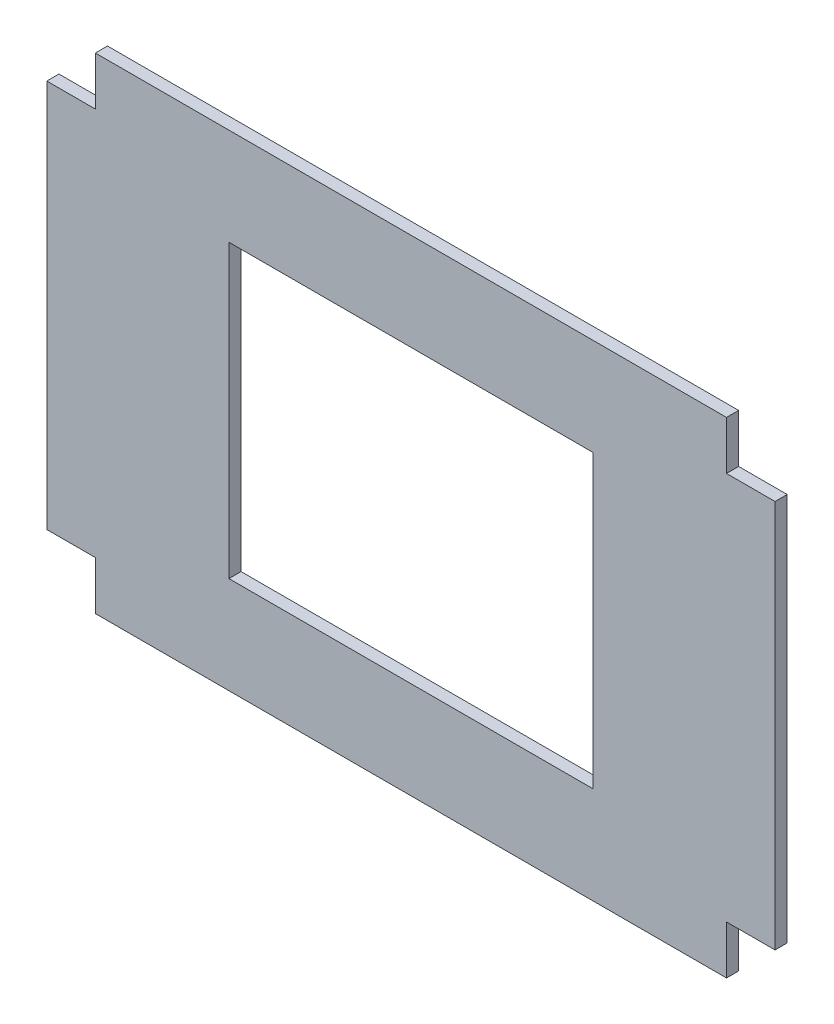
ISO-10303-21;
HEADER;
FILE_DESCRIPTION(('STEP AP214'),'2;1');
FILE_NAME('part.step','',(''),(''),'','','');
FILE_SCHEMA(('AUTOMOTIVE_DESIGN { 1 0 10303 214 1 1 1 1 }'));
ENDSEC;
DATA;
#1=APPLICATION_CONTEXT('core data for automotive mechanical design processes');
#2=APPLICATION_PROTOCOL_DEFINITION('international standard','automotive_design',2000,#1);
#3=PRODUCT_CONTEXT('',#1,'mechanical');
#4=PRODUCT('Part','Part','',(#3));
#5=PRODUCT_RELATED_PRODUCT_CATEGORY('part','',(#4));
#6=PRODUCT_DEFINITION_FORMATION('','',#4);
#7=PRODUCT_DEFINITION_CONTEXT('part definition',#1,'design');
#8=PRODUCT_DEFINITION('design','',#6,#7);
#9=PRODUCT_DEFINITION_SHAPE('','',#8);
#10=(LENGTH_UNIT() NAMED_UNIT(*) SI_UNIT(.MILLI.,.METRE.));
#11=(NAMED_UNIT(*) PLANE_ANGLE_UNIT() SI_UNIT($,.RADIAN.));
#12=(NAMED_UNIT(*) SI_UNIT($,.STERADIAN.) SOLID_ANGLE_UNIT());
#13=UNCERTAINTY_MEASURE_WITH_UNIT(LENGTH_MEASURE(1.E-05),#10,'distance_accuracy_value','');
#14=(GEOMETRIC_REPRESENTATION_CONTEXT(3) GLOBAL_UNCERTAINTY_ASSIGNED_CONTEXT((#13)) GLOBAL_UNIT_ASSIGNED_CONTEXT((#10,
#11,#12)) REPRESENTATION_CONTEXT('',''));
#15=CARTESIAN_POINT('',(0.,0.,0.));
#16=DIRECTION('',(0.,0.,1.));
#17=DIRECTION('',(1.,0.,0.));
#18=AXIS2_PLACEMENT_3D('',#15,#16,#17);
#19=CARTESIAN_POINT('',(5.06544502617801,8.7369109947644,5.));
#20=DIRECTION('',(-1.,0.,0.));
#21=DIRECTION('',(0.,-1.,0.));
#22=AXIS2_PLACEMENT_3D('',#19,#20,#21);
#23=PLANE('',#22);
#24=DIRECTION('',(0.,1.,0.));
#25=VECTOR('',#24,1.);
#26=CARTESIAN_POINT('',(5.06544502617801,8.7369109947644,0.));
#27=LINE('',#26,#25);
#28=CARTESIAN_POINT('',(5.06544502617801,-171.263089005236,0.));
#29=VERTEX_POINT('',#28);
#30=CARTESIAN_POINT('',(5.06544502617801,-11.2630890052356,0.));
#31=VERTEX_POINT('',#30);
#32=EDGE_CURVE('E256',#29,#31,#27,.T.);
#33=ORIENTED_EDGE('',*,*,#32,.T.);
#34=DIRECTION('',(0.,0.,1.));
#35=VECTOR('',#34,1.);
#36=CARTESIAN_POINT('',(5.06544502617801,-11.2630890052356,-5.));
#37=LINE('',#36,#35);
#38=CARTESIAN_POINT('',(5.06544502617801,-11.2630890052356,5.));
#39=VERTEX_POINT('',#38);
#40=EDGE_CURVE('E218',#31,#39,#37,.T.);
#41=ORIENTED_EDGE('',*,*,#40,.T.);
#42=DIRECTION('',(0.,1.,0.));
#43=VECTOR('',#42,1.);
#44=CARTESIAN_POINT('',(5.06544502617801,8.7369109947644,5.));
#45=LINE('',#44,#43);
#46=CARTESIAN_POINT('',(5.06544502617801,-171.263089005236,5.));
#47=VERTEX_POINT('',#46);
#48=EDGE_CURVE('E262',#47,#39,#45,.T.);
#49=ORIENTED_EDGE('',*,*,#48,.F.);
#50=DIRECTION('',(0.,0.,1.));
#51=VECTOR('',#50,1.);
#52=CARTESIAN_POINT('',(5.06544502617801,-171.263089005236,-5.));
#53=LINE('',#52,#51);
#54=EDGE_CURVE('E194',#29,#47,#53,.T.);
#55=ORIENTED_EDGE('',*,*,#54,.F.);
#56=EDGE_LOOP('',(#33,#41,#49,#55));
#57=FACE_BOUND('',#56,.T.);
#58=ADVANCED_FACE('F45',(#57),#23,.F.);
#59=CARTESIAN_POINT('',(-294.934554973822,8.7369109947644,5.));
#60=DIRECTION('',(0.,-1.,0.));
#61=DIRECTION('',(0.,0.,-1.));
#62=AXIS2_PLACEMENT_3D('',#59,#60,#61);
#63=PLANE('',#62);
#64=DIRECTION('',(-1.,0.,0.));
#65=VECTOR('',#64,1.);
#66=CARTESIAN_POINT('',(-294.934554973822,8.7369109947644,5.));
#67=LINE('',#66,#65);
#68=CARTESIAN_POINT('',(-14.934554973822,8.7369109947644,5.));
#69=VERTEX_POINT('',#68);
#70=CARTESIAN_POINT('',(-274.934554973822,8.7369109947644,5.));
#71=VERTEX_POINT('',#70);
#72=EDGE_CURVE('E266',#69,#71,#67,.T.);
#73=ORIENTED_EDGE('',*,*,#72,.F.);
#74=DIRECTION('',(0.,0.,1.));
#75=VECTOR('',#74,1.);
#76=CARTESIAN_POINT('',(-14.934554973822,8.7369109947644,-5.));
#77=LINE('',#76,#75);
#78=CARTESIAN_POINT('',(-14.934554973822,8.7369109947644,0.));
#79=VERTEX_POINT('',#78);
#80=EDGE_CURVE('E211',#79,#69,#77,.T.);
#81=ORIENTED_EDGE('',*,*,#80,.F.);
#82=DIRECTION('',(-1.,0.,0.));
#83=VECTOR('',#82,1.);
#84=CARTESIAN_POINT('',(-294.934554973822,8.7369109947644,0.));
#85=LINE('',#84,#83);
#86=CARTESIAN_POINT('',(-274.934554973822,8.7369109947644,0.));
#87=VERTEX_POINT('',#86);
#88=EDGE_CURVE('E283',#79,#87,#85,.T.);
#89=ORIENTED_EDGE('',*,*,#88,.T.);
#90=DIRECTION('',(0.,0.,1.));
#91=VECTOR('',#90,1.);
#92=CARTESIAN_POINT('',(-274.934554973822,8.7369109947644,-5.));
#93=LINE('',#92,#91);
#94=EDGE_CURVE('E252',#87,#71,#93,.T.);
#95=ORIENTED_EDGE('',*,*,#94,.T.);
#96=EDGE_LOOP('',(#73,#81,#89,#95));
#97=FACE_BOUND('',#96,.T.);
#98=ADVANCED_FACE('F353',(#97),#63,.F.);
#99=CARTESIAN_POINT('',(-294.934554973822,8.7369109947644,5.));
#100=DIRECTION('',(1.,0.,0.));
#101=DIRECTION('',(0.,0.,-1.));
#102=AXIS2_PLACEMENT_3D('',#99,#100,#101);
#103=PLANE('',#102);
#104=DIRECTION('',(0.,-1.,0.));
#105=VECTOR('',#104,1.);
#106=CARTESIAN_POINT('',(-294.934554973822,8.7369109947644,0.));
#107=LINE('',#106,#105);
#108=CARTESIAN_POINT('',(-294.934554973822,-11.2630890052356,0.));
#109=VERTEX_POINT('',#108);
#110=CARTESIAN_POINT('',(-294.934554973822,-171.263089005236,0.));
#111=VERTEX_POINT('',#110);
#112=EDGE_CURVE('E287',#109,#111,#107,.T.);
#113=ORIENTED_EDGE('',*,*,#112,.T.);
#114=DIRECTION('',(0.,0.,1.));
#115=VECTOR('',#114,1.);
#116=CARTESIAN_POINT('',(-294.934554973822,-171.263089005236,-5.));
#117=LINE('',#116,#115);
#118=CARTESIAN_POINT('',(-294.934554973822,-171.263089005236,5.));
#119=VERTEX_POINT('',#118);
#120=EDGE_CURVE('E210',#111,#119,#117,.T.);
#121=ORIENTED_EDGE('',*,*,#120,.T.);
#122=DIRECTION('',(0.,-1.,0.));
#123=VECTOR('',#122,1.);
#124=CARTESIAN_POINT('',(-294.934554973822,8.7369109947644,5.));
#125=LINE('',#124,#123);
#126=CARTESIAN_POINT('',(-294.934554973822,-11.2630890052356,5.));
#127=VERTEX_POINT('',#126);
#128=EDGE_CURVE('E271',#127,#119,#125,.T.);
#129=ORIENTED_EDGE('',*,*,#128,.F.);
#130=DIRECTION('',(0.,0.,1.));
#131=VECTOR('',#130,1.);
#132=CARTESIAN_POINT('',(-294.934554973822,-11.2630890052356,-5.));
#133=LINE('',#132,#131);
#134=EDGE_CURVE('E251',#109,#127,#133,.T.);
#135=ORIENTED_EDGE('',*,*,#134,.F.);
#136=EDGE_LOOP('',(#113,#121,#129,#135));
#137=FACE_BOUND('',#136,.T.);
#138=ADVANCED_FACE('F358',(#137),#103,.F.);
#139=CARTESIAN_POINT('',(-294.934554973822,-191.263089005236,5.));
#140=DIRECTION('',(0.,1.,0.));
#141=DIRECTION('',(0.,0.,1.));
#142=AXIS2_PLACEMENT_3D('',#139,#140,#141);
#143=PLANE('',#142);
#144=DIRECTION('',(1.,0.,0.));
#145=VECTOR('',#144,1.);
#146=CARTESIAN_POINT('',(-294.934554973822,-191.263089005236,5.));
#147=LINE('',#146,#145);
#148=CARTESIAN_POINT('',(-274.934554973822,-191.263089005236,5.));
#149=VERTEX_POINT('',#148);
#150=CARTESIAN_POINT('',(-14.934554973822,-191.263089005236,5.));
#151=VERTEX_POINT('',#150);
#152=EDGE_CURVE('E275',#149,#151,#147,.T.);
#153=ORIENTED_EDGE('',*,*,#152,.F.);
#154=DIRECTION('',(0.,0.,1.));
#155=VECTOR('',#154,1.);
#156=CARTESIAN_POINT('',(-274.934554973822,-191.263089005236,-5.));
#157=LINE('',#156,#155);
#158=CARTESIAN_POINT('',(-274.934554973822,-191.263089005236,0.));
#159=VERTEX_POINT('',#158);
#160=EDGE_CURVE('E230',#159,#149,#157,.T.);
#161=ORIENTED_EDGE('',*,*,#160,.F.);
#162=DIRECTION('',(1.,0.,0.));
#163=VECTOR('',#162,1.);
#164=CARTESIAN_POINT('',(-294.934554973822,-191.263089005236,0.));
#165=LINE('',#164,#163);
#166=CARTESIAN_POINT('',(-14.934554973822,-191.263089005236,0.));
#167=VERTEX_POINT('',#166);
#168=EDGE_CURVE('E267',#159,#167,#165,.T.);
#169=ORIENTED_EDGE('',*,*,#168,.T.);
#170=DIRECTION('',(0.,0.,1.));
#171=VECTOR('',#170,1.);
#172=CARTESIAN_POINT('',(-14.934554973822,-191.263089005236,-5.));
#173=LINE('',#172,#171);
#174=EDGE_CURVE('E189',#167,#151,#173,.T.);
#175=ORIENTED_EDGE('',*,*,#174,.T.);
#176=EDGE_LOOP('',(#153,#161,#169,#175));
#177=FACE_BOUND('',#176,.T.);
#178=ADVANCED_FACE('F380',(#177),#143,.F.);
#179=CARTESIAN_POINT('',(0.,0.,5.));
#180=DIRECTION('',(0.,0.,1.));
#181=DIRECTION('',(1.,0.,0.));
#182=AXIS2_PLACEMENT_3D('',#179,#180,#181);
#183=PLANE('',#182);
#184=DIRECTION('',(0.,-1.,0.));
#185=VECTOR('',#184,1.);
#186=CARTESIAN_POINT('',(-219.934554973822,-151.263089005236,5.));
#187=LINE('',#186,#185);
#188=CARTESIAN_POINT('',(-219.934554973822,-31.2630890052356,5.));
#189=VERTEX_POINT('',#188);
#190=CARTESIAN_POINT('',(-219.934554973822,-151.263089005236,5.));
#191=VERTEX_POINT('',#190);
#192=EDGE_CURVE('E60',#189,#191,#187,.T.);
#193=ORIENTED_EDGE('',*,*,#192,.F.);
#194=DIRECTION('',(-1.,0.,0.));
#195=VECTOR('',#194,1.);
#196=CARTESIAN_POINT('',(-69.934554973822,-31.2630890052356,5.));
#197=LINE('',#196,#195);
#198=CARTESIAN_POINT('',(-69.934554973822,-31.2630890052356,5.));
#199=VERTEX_POINT('',#198);
#200=EDGE_CURVE('E179',#199,#189,#197,.T.);
#201=ORIENTED_EDGE('',*,*,#200,.F.);
#202=DIRECTION('',(0.,1.,0.));
#203=VECTOR('',#202,1.);
#204=CARTESIAN_POINT('',(-69.934554973822,-151.263089005236,5.));
#205=LINE('',#204,#203);
#206=CARTESIAN_POINT('',(-69.934554973822,-151.263089005236,5.));
#207=VERTEX_POINT('',#206);
#208=EDGE_CURVE('E161',#207,#199,#205,.T.);
#209=ORIENTED_EDGE('',*,*,#208,.F.);
#210=DIRECTION('',(1.,0.,0.));
#211=VECTOR('',#210,1.);
#212=CARTESIAN_POINT('',(-69.934554973822,-151.263089005236,5.));
#213=LINE('',#212,#211);
#214=EDGE_CURVE('E171',#191,#207,#213,.T.);
#215=ORIENTED_EDGE('',*,*,#214,.F.);
#216=EDGE_LOOP('',(#193,#201,#209,#215));
#217=FACE_BOUND('',#216,.T.);
#218=DIRECTION('',(1.,0.,0.));
#219=VECTOR('',#218,1.);
#220=CARTESIAN_POINT('',(5.06544502617801,-11.2630890052356,5.));
#221=LINE('',#220,#219);
#222=CARTESIAN_POINT('',(-14.934554973822,-11.2630890052356,5.));
#223=VERTEX_POINT('',#222);
#224=EDGE_CURVE('E214',#223,#39,#221,.T.);
#225=ORIENTED_EDGE('',*,*,#224,.F.);
#226=DIRECTION('',(0.,-1.,0.));
#227=VECTOR('',#226,1.);
#228=CARTESIAN_POINT('',(-14.934554973822,8.7369109947644,5.));
#229=LINE('',#228,#227);
#230=EDGE_CURVE('E225',#69,#223,#229,.T.);
#231=ORIENTED_EDGE('',*,*,#230,.F.);
#232=ORIENTED_EDGE('',*,*,#72,.T.);
#233=DIRECTION('',(0.,1.,0.));
#234=VECTOR('',#233,1.);
#235=CARTESIAN_POINT('',(-274.934554973822,8.7369109947644,5.));
#236=LINE('',#235,#234);
#237=CARTESIAN_POINT('',(-274.934554973822,-11.2630890052356,5.));
#238=VERTEX_POINT('',#237);
#239=EDGE_CURVE('E248',#238,#71,#236,.T.);
#240=ORIENTED_EDGE('',*,*,#239,.F.);
#241=DIRECTION('',(1.,0.,0.));
#242=VECTOR('',#241,1.);
#243=CARTESIAN_POINT('',(-294.934554973822,-11.2630890052356,5.));
#244=LINE('',#243,#242);
#245=EDGE_CURVE('E229',#127,#238,#244,.T.);
#246=ORIENTED_EDGE('',*,*,#245,.F.);
#247=ORIENTED_EDGE('',*,*,#128,.T.);
#248=DIRECTION('',(-1.,0.,0.));
#249=VECTOR('',#248,1.);
#250=CARTESIAN_POINT('',(-294.934554973822,-171.263089005236,5.));
#251=LINE('',#250,#249);
#252=CARTESIAN_POINT('',(-274.934554973822,-171.263089005236,5.));
#253=VERTEX_POINT('',#252);
#254=EDGE_CURVE('E233',#253,#119,#251,.T.);
#255=ORIENTED_EDGE('',*,*,#254,.F.);
#256=DIRECTION('',(0.,1.,0.));
#257=VECTOR('',#256,1.);
#258=CARTESIAN_POINT('',(-274.934554973822,-191.263089005236,5.));
#259=LINE('',#258,#257);
#260=EDGE_CURVE('E222',#149,#253,#259,.T.);
#261=ORIENTED_EDGE('',*,*,#260,.F.);
#262=ORIENTED_EDGE('',*,*,#152,.T.);
#263=DIRECTION('',(0.,-1.,0.));
#264=VECTOR('',#263,1.);
#265=CARTESIAN_POINT('',(-14.934554973822,-191.263089005236,5.));
#266=LINE('',#265,#264);
#267=CARTESIAN_POINT('',(-14.934554973822,-171.263089005236,5.));
#268=VERTEX_POINT('',#267);
#269=EDGE_CURVE('E197',#268,#151,#266,.T.);
#270=ORIENTED_EDGE('',*,*,#269,.F.);
#271=DIRECTION('',(-1.,0.,0.));
#272=VECTOR('',#271,1.);
#273=CARTESIAN_POINT('',(5.06544502617801,-171.263089005236,5.));
#274=LINE('',#273,#272);
#275=EDGE_CURVE('E206',#47,#268,#274,.T.);
#276=ORIENTED_EDGE('',*,*,#275,.F.);
#277=ORIENTED_EDGE('',*,*,#48,.T.);
#278=EDGE_LOOP('',(#225,#231,#232,#240,#246,#247,#255,#261,#262,#270,#276,#277));
#279=FACE_BOUND('',#278,.T.);
#280=ADVANCED_FACE('F176',(#217,#279),#183,.T.);
#281=CARTESIAN_POINT('',(0.,0.,0.));
#282=DIRECTION('',(0.,0.,1.));
#283=DIRECTION('',(1.,0.,0.));
#284=AXIS2_PLACEMENT_3D('',#281,#282,#283);
#285=PLANE('',#284);
#286=DIRECTION('',(-1.,0.,0.));
#287=VECTOR('',#286,1.);
#288=CARTESIAN_POINT('',(0.,-31.2630890052356,0.));
#289=LINE('',#288,#287);
#290=CARTESIAN_POINT('',(-69.934554973822,-31.2630890052356,0.));
#291=VERTEX_POINT('',#290);
#292=CARTESIAN_POINT('',(-219.934554973822,-31.2630890052356,0.));
#293=VERTEX_POINT('',#292);
#294=EDGE_CURVE('E53',#291,#293,#289,.T.);
#295=ORIENTED_EDGE('',*,*,#294,.T.);
#296=DIRECTION('',(0.,-1.,0.));
#297=VECTOR('',#296,1.);
#298=CARTESIAN_POINT('',(-219.934554973822,0.,0.));
#299=LINE('',#298,#297);
#300=CARTESIAN_POINT('',(-219.934554973822,-151.263089005236,0.));
#301=VERTEX_POINT('',#300);
#302=EDGE_CURVE('E11',#293,#301,#299,.T.);
#303=ORIENTED_EDGE('',*,*,#302,.T.);
#304=DIRECTION('',(1.,0.,0.));
#305=VECTOR('',#304,1.);
#306=CARTESIAN_POINT('',(0.,-151.263089005236,0.));
#307=LINE('',#306,#305);
#308=CARTESIAN_POINT('',(-69.934554973822,-151.263089005236,0.));
#309=VERTEX_POINT('',#308);
#310=EDGE_CURVE('E325',#301,#309,#307,.T.);
#311=ORIENTED_EDGE('',*,*,#310,.T.);
#312=DIRECTION('',(0.,1.,0.));
#313=VECTOR('',#312,1.);
#314=CARTESIAN_POINT('',(-69.934554973822,0.,0.));
#315=LINE('',#314,#313);
#316=EDGE_CURVE('E164',#309,#291,#315,.T.);
#317=ORIENTED_EDGE('',*,*,#316,.T.);
#318=EDGE_LOOP('',(#295,#303,#311,#317));
#319=FACE_BOUND('',#318,.T.);
#320=DIRECTION('',(0.,-1.,0.));
#321=VECTOR('',#320,1.);
#322=CARTESIAN_POINT('',(-14.934554973822,0.,0.));
#323=LINE('',#322,#321);
#324=CARTESIAN_POINT('',(-14.934554973822,-11.2630890052356,0.));
#325=VERTEX_POINT('',#324);
#326=EDGE_CURVE('E317',#79,#325,#323,.T.);
#327=ORIENTED_EDGE('',*,*,#326,.T.);
#328=DIRECTION('',(1.,0.,0.));
#329=VECTOR('',#328,1.);
#330=CARTESIAN_POINT('',(0.,-11.2630890052356,0.));
#331=LINE('',#330,#329);
#332=EDGE_CURVE('E321',#325,#31,#331,.T.);
#333=ORIENTED_EDGE('',*,*,#332,.T.);
#334=ORIENTED_EDGE('',*,*,#32,.F.);
#335=DIRECTION('',(-1.,0.,0.));
#336=VECTOR('',#335,1.);
#337=CARTESIAN_POINT('',(0.,-171.263089005236,0.));
#338=LINE('',#337,#336);
#339=CARTESIAN_POINT('',(-14.934554973822,-171.263089005236,0.));
#340=VERTEX_POINT('',#339);
#341=EDGE_CURVE('E301',#29,#340,#338,.T.);
#342=ORIENTED_EDGE('',*,*,#341,.T.);
#343=DIRECTION('',(0.,-1.,0.));
#344=VECTOR('',#343,1.);
#345=CARTESIAN_POINT('',(-14.934554973822,0.,0.));
#346=LINE('',#345,#344);
#347=EDGE_CURVE('E305',#340,#167,#346,.T.);
#348=ORIENTED_EDGE('',*,*,#347,.T.);
#349=ORIENTED_EDGE('',*,*,#168,.F.);
#350=DIRECTION('',(0.,1.,0.));
#351=VECTOR('',#350,1.);
#352=CARTESIAN_POINT('',(-274.934554973822,0.,0.));
#353=LINE('',#352,#351);
#354=CARTESIAN_POINT('',(-274.934554973822,-171.263089005236,0.));
#355=VERTEX_POINT('',#354);
#356=EDGE_CURVE('E309',#159,#355,#353,.T.);
#357=ORIENTED_EDGE('',*,*,#356,.T.);
#358=DIRECTION('',(-1.,0.,0.));
#359=VECTOR('',#358,1.);
#360=CARTESIAN_POINT('',(0.,-171.263089005236,0.));
#361=LINE('',#360,#359);
#362=EDGE_CURVE('E313',#355,#111,#361,.T.);
#363=ORIENTED_EDGE('',*,*,#362,.T.);
#364=ORIENTED_EDGE('',*,*,#112,.F.);
#365=DIRECTION('',(1.,0.,0.));
#366=VECTOR('',#365,1.);
#367=CARTESIAN_POINT('',(0.,-11.2630890052356,0.));
#368=LINE('',#367,#366);
#369=CARTESIAN_POINT('',(-274.934554973822,-11.2630890052356,0.));
#370=VERTEX_POINT('',#369);
#371=EDGE_CURVE('E279',#109,#370,#368,.T.);
#372=ORIENTED_EDGE('',*,*,#371,.T.);
#373=DIRECTION('',(0.,1.,0.));
#374=VECTOR('',#373,1.);
#375=CARTESIAN_POINT('',(-274.934554973822,0.,0.));
#376=LINE('',#375,#374);
#377=EDGE_CURVE('E297',#370,#87,#376,.T.);
#378=ORIENTED_EDGE('',*,*,#377,.T.);
#379=ORIENTED_EDGE('',*,*,#88,.F.);
#380=EDGE_LOOP('',(#327,#333,#334,#342,#348,#349,#357,#363,#364,#372,#378,#379));
#381=FACE_BOUND('',#380,.T.);
#382=ADVANCED_FACE('F332',(#319,#381),#285,.F.);
#383=CARTESIAN_POINT('',(-274.934554973822,8.7369109947644,-5.));
#384=DIRECTION('',(1.,0.,0.));
#385=DIRECTION('',(0.,0.,-1.));
#386=AXIS2_PLACEMENT_3D('',#383,#384,#385);
#387=PLANE('',#386);
#388=DIRECTION('',(0.,0.,1.));
#389=VECTOR('',#388,1.);
#390=CARTESIAN_POINT('',(-274.934554973822,-11.2630890052356,-5.));
#391=LINE('',#390,#389);
#392=EDGE_CURVE('E257',#370,#238,#391,.T.);
#393=ORIENTED_EDGE('',*,*,#392,.T.);
#394=ORIENTED_EDGE('',*,*,#239,.T.);
#395=ORIENTED_EDGE('',*,*,#94,.F.);
#396=ORIENTED_EDGE('',*,*,#377,.F.);
#397=EDGE_LOOP('',(#393,#394,#395,#396));
#398=FACE_BOUND('',#397,.T.);
#399=ADVANCED_FACE('F398',(#398),#387,.F.);
#400=CARTESIAN_POINT('',(-294.934554973822,-11.2630890052356,-5.));
#401=DIRECTION('',(0.,-1.,0.));
#402=DIRECTION('',(0.,0.,-1.));
#403=AXIS2_PLACEMENT_3D('',#400,#401,#402);
#404=PLANE('',#403);
#405=ORIENTED_EDGE('',*,*,#134,.T.);
#406=ORIENTED_EDGE('',*,*,#245,.T.);
#407=ORIENTED_EDGE('',*,*,#392,.F.);
#408=ORIENTED_EDGE('',*,*,#371,.F.);
#409=EDGE_LOOP('',(#405,#406,#407,#408));
#410=FACE_BOUND('',#409,.T.);
#411=ADVANCED_FACE('F395',(#410),#404,.F.);
#412=CARTESIAN_POINT('',(-14.934554973822,-191.263089005236,-5.));
#413=DIRECTION('',(-1.,0.,0.));
#414=DIRECTION('',(0.,0.,1.));
#415=AXIS2_PLACEMENT_3D('',#412,#413,#414);
#416=PLANE('',#415);
#417=DIRECTION('',(0.,0.,1.));
#418=VECTOR('',#417,1.);
#419=CARTESIAN_POINT('',(-14.934554973822,-171.263089005236,-5.));
#420=LINE('',#419,#418);
#421=EDGE_CURVE('E198',#340,#268,#420,.T.);
#422=ORIENTED_EDGE('',*,*,#421,.T.);
#423=ORIENTED_EDGE('',*,*,#269,.T.);
#424=ORIENTED_EDGE('',*,*,#174,.F.);
#425=ORIENTED_EDGE('',*,*,#347,.F.);
#426=EDGE_LOOP('',(#422,#423,#424,#425));
#427=FACE_BOUND('',#426,.T.);
#428=ADVANCED_FACE('F375',(#427),#416,.F.);
#429=CARTESIAN_POINT('',(5.06544502617801,-171.263089005236,-5.));
#430=DIRECTION('',(0.,1.,0.));
#431=DIRECTION('',(0.,0.,1.));
#432=AXIS2_PLACEMENT_3D('',#429,#430,#431);
#433=PLANE('',#432);
#434=ORIENTED_EDGE('',*,*,#54,.T.);
#435=ORIENTED_EDGE('',*,*,#275,.T.);
#436=ORIENTED_EDGE('',*,*,#421,.F.);
#437=ORIENTED_EDGE('',*,*,#341,.F.);
#438=EDGE_LOOP('',(#434,#435,#436,#437));
#439=FACE_BOUND('',#438,.T.);
#440=ADVANCED_FACE('F372',(#439),#433,.F.);
#441=CARTESIAN_POINT('',(-294.934554973822,-171.263089005236,-5.));
#442=DIRECTION('',(0.,1.,0.));
#443=DIRECTION('',(0.,0.,1.));
#444=AXIS2_PLACEMENT_3D('',#441,#442,#443);
#445=PLANE('',#444);
#446=DIRECTION('',(0.,0.,1.));
#447=VECTOR('',#446,1.);
#448=CARTESIAN_POINT('',(-274.934554973822,-171.263089005236,-5.));
#449=LINE('',#448,#447);
#450=EDGE_CURVE('E234',#355,#253,#449,.T.);
#451=ORIENTED_EDGE('',*,*,#450,.T.);
#452=ORIENTED_EDGE('',*,*,#254,.T.);
#453=ORIENTED_EDGE('',*,*,#120,.F.);
#454=ORIENTED_EDGE('',*,*,#362,.F.);
#455=EDGE_LOOP('',(#451,#452,#453,#454));
#456=FACE_BOUND('',#455,.T.);
#457=ADVANCED_FACE('F388',(#456),#445,.F.);
#458=CARTESIAN_POINT('',(-274.934554973822,-191.263089005236,-5.));
#459=DIRECTION('',(1.,0.,0.));
#460=DIRECTION('',(0.,0.,-1.));
#461=AXIS2_PLACEMENT_3D('',#458,#459,#460);
#462=PLANE('',#461);
#463=ORIENTED_EDGE('',*,*,#160,.T.);
#464=ORIENTED_EDGE('',*,*,#260,.T.);
#465=ORIENTED_EDGE('',*,*,#450,.F.);
#466=ORIENTED_EDGE('',*,*,#356,.F.);
#467=EDGE_LOOP('',(#463,#464,#465,#466));
#468=FACE_BOUND('',#467,.T.);
#469=ADVANCED_FACE('F383',(#468),#462,.F.);
#470=CARTESIAN_POINT('',(5.06544502617801,-11.2630890052356,-5.));
#471=DIRECTION('',(0.,-1.,0.));
#472=DIRECTION('',(0.,0.,-1.));
#473=AXIS2_PLACEMENT_3D('',#470,#471,#472);
#474=PLANE('',#473);
#475=DIRECTION('',(0.,0.,1.));
#476=VECTOR('',#475,1.);
#477=CARTESIAN_POINT('',(-14.934554973822,-11.2630890052356,-5.));
#478=LINE('',#477,#476);
#479=EDGE_CURVE('E215',#325,#223,#478,.T.);
#480=ORIENTED_EDGE('',*,*,#479,.T.);
#481=ORIENTED_EDGE('',*,*,#224,.T.);
#482=ORIENTED_EDGE('',*,*,#40,.F.);
#483=ORIENTED_EDGE('',*,*,#332,.F.);
#484=EDGE_LOOP('',(#480,#481,#482,#483));
#485=FACE_BOUND('',#484,.T.);
#486=ADVANCED_FACE('F347',(#485),#474,.F.);
#487=CARTESIAN_POINT('',(-14.934554973822,8.7369109947644,-5.));
#488=DIRECTION('',(-1.,0.,0.));
#489=DIRECTION('',(0.,0.,1.));
#490=AXIS2_PLACEMENT_3D('',#487,#488,#489);
#491=PLANE('',#490);
#492=ORIENTED_EDGE('',*,*,#80,.T.);
#493=ORIENTED_EDGE('',*,*,#230,.T.);
#494=ORIENTED_EDGE('',*,*,#479,.F.);
#495=ORIENTED_EDGE('',*,*,#326,.F.);
#496=EDGE_LOOP('',(#492,#493,#494,#495));
#497=FACE_BOUND('',#496,.T.);
#498=ADVANCED_FACE('F339',(#497),#491,.F.);
#499=CARTESIAN_POINT('',(-219.934554973822,-151.263089005236,-5.));
#500=DIRECTION('',(-1.,0.,0.));
#501=DIRECTION('',(0.,0.,1.));
#502=AXIS2_PLACEMENT_3D('',#499,#500,#501);
#503=PLANE('',#502);
#504=DIRECTION('',(0.,0.,1.));
#505=VECTOR('',#504,1.);
#506=CARTESIAN_POINT('',(-219.934554973822,-31.2630890052356,-5.));
#507=LINE('',#506,#505);
#508=EDGE_CURVE('E186',#293,#189,#507,.T.);
#509=ORIENTED_EDGE('',*,*,#508,.T.);
#510=ORIENTED_EDGE('',*,*,#192,.T.);
#511=DIRECTION('',(0.,0.,1.));
#512=VECTOR('',#511,1.);
#513=CARTESIAN_POINT('',(-219.934554973822,-151.263089005236,-5.));
#514=LINE('',#513,#512);
#515=EDGE_CURVE('E168',#301,#191,#514,.T.);
#516=ORIENTED_EDGE('',*,*,#515,.F.);
#517=ORIENTED_EDGE('',*,*,#302,.F.);
#518=EDGE_LOOP('',(#509,#510,#516,#517));
#519=FACE_BOUND('',#518,.T.);
#520=ADVANCED_FACE('F337',(#519),#503,.F.);
#521=CARTESIAN_POINT('',(-69.934554973822,-31.2630890052356,-5.));
#522=DIRECTION('',(0.,1.,0.));
#523=DIRECTION('',(-1.,0.,0.));
#524=AXIS2_PLACEMENT_3D('',#521,#522,#523);
#525=PLANE('',#524);
#526=DIRECTION('',(0.,0.,1.));
#527=VECTOR('',#526,1.);
#528=CARTESIAN_POINT('',(-69.934554973822,-31.2630890052356,-5.));
#529=LINE('',#528,#527);
#530=EDGE_CURVE('E167',#291,#199,#529,.T.);
#531=ORIENTED_EDGE('',*,*,#530,.T.);
#532=ORIENTED_EDGE('',*,*,#200,.T.);
#533=ORIENTED_EDGE('',*,*,#508,.F.);
#534=ORIENTED_EDGE('',*,*,#294,.F.);
#535=EDGE_LOOP('',(#531,#532,#533,#534));
#536=FACE_BOUND('',#535,.T.);
#537=ADVANCED_FACE('F336',(#536),#525,.F.);
#538=CARTESIAN_POINT('',(-69.934554973822,-151.263089005236,-5.));
#539=DIRECTION('',(1.,0.,0.));
#540=DIRECTION('',(0.,0.,-1.));
#541=AXIS2_PLACEMENT_3D('',#538,#539,#540);
#542=PLANE('',#541);
#543=DIRECTION('',(0.,0.,1.));
#544=VECTOR('',#543,1.);
#545=CARTESIAN_POINT('',(-69.934554973822,-151.263089005236,-5.));
#546=LINE('',#545,#544);
#547=EDGE_CURVE('E68',#309,#207,#546,.T.);
#548=ORIENTED_EDGE('',*,*,#547,.T.);
#549=ORIENTED_EDGE('',*,*,#208,.T.);
#550=ORIENTED_EDGE('',*,*,#530,.F.);
#551=ORIENTED_EDGE('',*,*,#316,.F.);
#552=EDGE_LOOP('',(#548,#549,#550,#551));
#553=FACE_BOUND('',#552,.T.);
#554=ADVANCED_FACE('F158',(#553),#542,.F.);
#555=CARTESIAN_POINT('',(-69.934554973822,-151.263089005236,-5.));
#556=DIRECTION('',(0.,-1.,0.));
#557=DIRECTION('',(1.,0.,0.));
#558=AXIS2_PLACEMENT_3D('',#555,#556,#557);
#559=PLANE('',#558);
#560=ORIENTED_EDGE('',*,*,#515,.T.);
#561=ORIENTED_EDGE('',*,*,#214,.T.);
#562=ORIENTED_EDGE('',*,*,#547,.F.);
#563=ORIENTED_EDGE('',*,*,#310,.F.);
#564=EDGE_LOOP('',(#560,#561,#562,#563));
#565=FACE_BOUND('',#564,.T.);
#566=ADVANCED_FACE('F172',(#565),#559,.F.);
#567=CLOSED_SHELL('',(#58,#98,#138,#178,#280,#382,#399,#411,#428,#440,#457,#469,#486,#498,#520,
#537,#554,#566));
#568=MANIFOLD_SOLID_BREP('B2',#567);
#569=ADVANCED_BREP_SHAPE_REPRESENTATION('',(#18,#568),#14);
#570=SHAPE_DEFINITION_REPRESENTATION(#9,#569);
ENDSEC;
END-ISO-10303-21;
